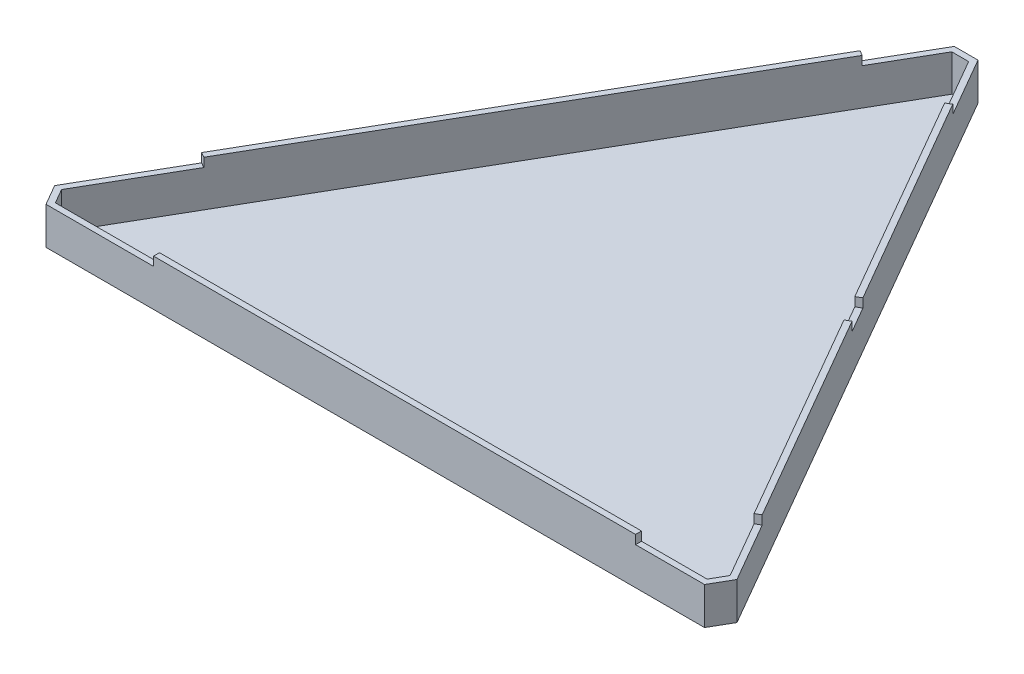
ISO-10303-21;
HEADER;
FILE_DESCRIPTION(('STEP AP214'),'2;1');
FILE_NAME('part.step','',(''),(''),'','','');
FILE_SCHEMA(('AUTOMOTIVE_DESIGN { 1 0 10303 214 1 1 1 1 }'));
ENDSEC;
DATA;
#1=APPLICATION_CONTEXT('core data for automotive mechanical design processes');
#2=APPLICATION_PROTOCOL_DEFINITION('international standard','automotive_design',2000,#1);
#3=PRODUCT_CONTEXT('',#1,'mechanical');
#4=PRODUCT('Part','Part','',(#3));
#5=PRODUCT_RELATED_PRODUCT_CATEGORY('part','',(#4));
#6=PRODUCT_DEFINITION_FORMATION('','',#4);
#7=PRODUCT_DEFINITION_CONTEXT('part definition',#1,'design');
#8=PRODUCT_DEFINITION('design','',#6,#7);
#9=PRODUCT_DEFINITION_SHAPE('','',#8);
#10=(LENGTH_UNIT() NAMED_UNIT(*) SI_UNIT(.MILLI.,.METRE.));
#11=(NAMED_UNIT(*) PLANE_ANGLE_UNIT() SI_UNIT($,.RADIAN.));
#12=(NAMED_UNIT(*) SI_UNIT($,.STERADIAN.) SOLID_ANGLE_UNIT());
#13=UNCERTAINTY_MEASURE_WITH_UNIT(LENGTH_MEASURE(1.E-05),#10,'distance_accuracy_value','');
#14=(GEOMETRIC_REPRESENTATION_CONTEXT(3) GLOBAL_UNCERTAINTY_ASSIGNED_CONTEXT((#13)) GLOBAL_UNIT_ASSIGNED_CONTEXT((#10,
#11,#12)) REPRESENTATION_CONTEXT('',''));
#15=CARTESIAN_POINT('',(0.,0.,0.));
#16=DIRECTION('',(0.,0.,1.));
#17=DIRECTION('',(1.,0.,0.));
#18=AXIS2_PLACEMENT_3D('',#15,#16,#17);
#19=CARTESIAN_POINT('',(0.,0.2,0.));
#20=DIRECTION('',(0.,1.,0.));
#21=DIRECTION('',(0.,0.,1.));
#22=AXIS2_PLACEMENT_3D('',#19,#20,#21);
#23=PLANE('',#22);
#24=DIRECTION('',(0.500000000000268,0.,-0.866025403784284));
#25=VECTOR('',#24,1.);
#26=CARTESIAN_POINT('',(84.5179491924025,0.2,48.7964607176236));
#27=LINE('',#26,#25);
#28=CARTESIAN_POINT('',(109.845299461621,0.2,4.92820323027552));
#29=VERTEX_POINT('',#28);
#30=CARTESIAN_POINT('',(112.690598923244,0.2,0.));
#31=VERTEX_POINT('',#30);
#32=EDGE_CURVE('E420',#29,#31,#27,.T.);
#33=ORIENTED_EDGE('',*,*,#32,.T.);
#34=DIRECTION('',(0.500000000000004,0.,0.866025403784437));
#35=VECTOR('',#34,1.);
#36=CARTESIAN_POINT('',(84.5179491924322,0.2,-48.7964607176063));
#37=LINE('',#36,#35);
#38=CARTESIAN_POINT('',(2.84529946162275,0.2,-190.257639640145));
#39=VERTEX_POINT('',#38);
#40=EDGE_CURVE('E60',#39,#31,#37,.T.);
#41=ORIENTED_EDGE('',*,*,#40,.F.);
#42=DIRECTION('',(1.,0.,-3.02401506656851E-13));
#43=VECTOR('',#42,1.);
#44=CARTESIAN_POINT('',(-5.7534196880156E-11,0.2,-190.257639640144));
#45=LINE('',#44,#43);
#46=CARTESIAN_POINT('',(-2.84529946162175,0.2,-190.257639640144));
#47=VERTEX_POINT('',#46);
#48=EDGE_CURVE('E424',#47,#39,#45,.T.);
#49=ORIENTED_EDGE('',*,*,#48,.F.);
#50=DIRECTION('',(-0.499999999999966,0.,0.866025403784458));
#51=VECTOR('',#50,1.);
#52=CARTESIAN_POINT('',(-84.5179491924274,0.2,-48.7964607175987));
#53=LINE('',#52,#51);
#54=CARTESIAN_POINT('',(-112.690598923241,0.2,0.));
#55=VERTEX_POINT('',#54);
#56=EDGE_CURVE('E52',#47,#55,#53,.T.);
#57=ORIENTED_EDGE('',*,*,#56,.T.);
#58=DIRECTION('',(-0.499999999999998,0.,-0.86602540378444));
#59=VECTOR('',#58,1.);
#60=CARTESIAN_POINT('',(-84.5179491924314,0.2,48.7964607176051));
#61=LINE('',#60,#59);
#62=CARTESIAN_POINT('',(-109.845299461621,0.200000000000001,4.92820323027554));
#63=VERTEX_POINT('',#62);
#64=EDGE_CURVE('E388',#63,#55,#61,.T.);
#65=ORIENTED_EDGE('',*,*,#64,.F.);
#66=DIRECTION('',(1.,0.,0.));
#67=VECTOR('',#66,1.);
#68=CARTESIAN_POINT('',(0.,0.2,4.92820323027603));
#69=LINE('',#68,#67);
#70=EDGE_CURVE('E418',#63,#29,#69,.T.);
#71=ORIENTED_EDGE('',*,*,#70,.T.);
#72=EDGE_LOOP('',(#33,#41,#49,#57,#65,#71));
#73=FACE_BOUND('',#72,.T.);
#74=ADVANCED_FACE('F37',(#73),#23,.T.);
#75=CARTESIAN_POINT('',(86.25,0.2,-49.7964607176053));
#76=DIRECTION('',(-0.866025403784439,0.,0.5));
#77=DIRECTION('',(0.5,0.,0.866025403784439));
#78=AXIS2_PLACEMENT_3D('',#75,#76,#77);
#79=PLANE('',#78);
#80=DIRECTION('',(-0.5,0.,-0.866025403784439));
#81=VECTOR('',#80,1.);
#82=CARTESIAN_POINT('',(86.25,0.,-49.7964607176053));
#83=LINE('',#82,#81);
#84=CARTESIAN_POINT('',(115.,0.,0.));
#85=VERTEX_POINT('',#84);
#86=CARTESIAN_POINT('',(4.,0.,-192.257639640145));
#87=VERTEX_POINT('',#86);
#88=EDGE_CURVE('E422',#85,#87,#83,.T.);
#89=ORIENTED_EDGE('',*,*,#88,.T.);
#90=DIRECTION('',(0.,-1.,0.));
#91=VECTOR('',#90,1.);
#92=CARTESIAN_POINT('',(4.,12.58,-192.257639640145));
#93=LINE('',#92,#91);
#94=CARTESIAN_POINT('',(4.,12.58,-192.257639640145));
#95=VERTEX_POINT('',#94);
#96=EDGE_CURVE('E357',#95,#87,#93,.T.);
#97=ORIENTED_EDGE('',*,*,#96,.F.);
#98=DIRECTION('',(0.500000000000004,0.,0.866025403784436));
#99=VECTOR('',#98,1.);
#100=CARTESIAN_POINT('',(86.2500000000004,12.58,-49.796460717606));
#101=LINE('',#100,#99);
#102=CARTESIAN_POINT('',(15.625000000015,12.58,-172.122549002131));
#103=VERTEX_POINT('',#102);
#104=EDGE_CURVE('E326',#95,#103,#101,.T.);
#105=ORIENTED_EDGE('',*,*,#104,.T.);
#106=DIRECTION('',(0.,-1.,0.));
#107=VECTOR('',#106,1.);
#108=CARTESIAN_POINT('',(15.625000000015,15.58,-172.122549002131));
#109=LINE('',#108,#107);
#110=CARTESIAN_POINT('',(15.625000000015,15.58,-172.122549002131));
#111=VERTEX_POINT('',#110);
#112=EDGE_CURVE('E268',#111,#103,#109,.T.);
#113=ORIENTED_EDGE('',*,*,#112,.F.);
#114=DIRECTION('',(0.500000000000004,0.,0.866025403784437));
#115=VECTOR('',#114,1.);
#116=CARTESIAN_POINT('',(86.2500000000004,15.58,-49.7964607176059));
#117=LINE('',#116,#115);
#118=CARTESIAN_POINT('',(57.0000000000145,15.58,-100.458946838971));
#119=VERTEX_POINT('',#118);
#120=EDGE_CURVE('E250',#111,#119,#117,.T.);
#121=ORIENTED_EDGE('',*,*,#120,.T.);
#122=DIRECTION('',(0.,-1.,0.));
#123=VECTOR('',#122,1.);
#124=CARTESIAN_POINT('',(57.0000000000145,15.58,-100.458946838971));
#125=LINE('',#124,#123);
#126=CARTESIAN_POINT('',(57.0000000000145,12.58,-100.458946838971));
#127=VERTEX_POINT('',#126);
#128=EDGE_CURVE('E270',#119,#127,#125,.T.);
#129=ORIENTED_EDGE('',*,*,#128,.T.);
#130=DIRECTION('',(0.499999999999934,0.,0.866025403784477));
#131=VECTOR('',#130,1.);
#132=CARTESIAN_POINT('',(86.2500000000003,12.58,-49.7964607175967));
#133=LINE('',#132,#131);
#134=CARTESIAN_POINT('',(62.0000000000138,12.58,-91.7986928011259));
#135=VERTEX_POINT('',#134);
#136=EDGE_CURVE('E317',#127,#135,#133,.T.);
#137=ORIENTED_EDGE('',*,*,#136,.T.);
#138=DIRECTION('',(0.,-1.,0.));
#139=VECTOR('',#138,1.);
#140=CARTESIAN_POINT('',(62.0000000000138,15.58,-91.7986928011259));
#141=LINE('',#140,#139);
#142=CARTESIAN_POINT('',(62.0000000000138,15.58,-91.7986928011259));
#143=VERTEX_POINT('',#142);
#144=EDGE_CURVE('E495',#143,#135,#141,.T.);
#145=ORIENTED_EDGE('',*,*,#144,.F.);
#146=DIRECTION('',(0.500000000000004,0.,0.866025403784436));
#147=VECTOR('',#146,1.);
#148=CARTESIAN_POINT('',(86.2499999999997,15.58,-49.7964607176056));
#149=LINE('',#148,#147);
#150=CARTESIAN_POINT('',(103.375000000009,15.58,-20.1350906379728));
#151=VERTEX_POINT('',#150);
#152=EDGE_CURVE('E240',#143,#151,#149,.T.);
#153=ORIENTED_EDGE('',*,*,#152,.T.);
#154=DIRECTION('',(0.,-1.,0.));
#155=VECTOR('',#154,1.);
#156=CARTESIAN_POINT('',(103.375000000009,15.58,-20.1350906379728));
#157=LINE('',#156,#155);
#158=CARTESIAN_POINT('',(103.375000000009,12.58,-20.1350906379728));
#159=VERTEX_POINT('',#158);
#160=EDGE_CURVE('E252',#151,#159,#157,.T.);
#161=ORIENTED_EDGE('',*,*,#160,.T.);
#162=DIRECTION('',(-0.5,0.,-0.866025403784439));
#163=VECTOR('',#162,1.);
#164=CARTESIAN_POINT('',(86.25,12.58,-49.7964607176053));
#165=LINE('',#164,#163);
#166=CARTESIAN_POINT('',(115.,12.58,0.));
#167=VERTEX_POINT('',#166);
#168=EDGE_CURVE('E410',#167,#159,#165,.T.);
#169=ORIENTED_EDGE('',*,*,#168,.F.);
#170=DIRECTION('',(0.,-1.,0.));
#171=VECTOR('',#170,1.);
#172=CARTESIAN_POINT('',(115.,0.2,0.));
#173=LINE('',#172,#171);
#174=EDGE_CURVE('E429',#167,#85,#173,.T.);
#175=ORIENTED_EDGE('',*,*,#174,.T.);
#176=EDGE_LOOP('',(#89,#97,#105,#113,#121,#129,#137,#145,#153,#161,#169,#175));
#177=FACE_BOUND('',#176,.T.);
#178=ADVANCED_FACE('F39',(#177),#79,.F.);
#179=CARTESIAN_POINT('',(-86.2499999999976,0.2,-49.7964607176066));
#180=DIRECTION('',(-0.866025403784427,0.,-0.500000000000021));
#181=DIRECTION('',(-0.500000000000021,0.,0.866025403784427));
#182=AXIS2_PLACEMENT_3D('',#179,#180,#181);
#183=PLANE('',#182);
#184=DIRECTION('',(0.,-1.,0.));
#185=VECTOR('',#184,1.);
#186=CARTESIAN_POINT('',(-4.,12.58,-192.257639640145));
#187=LINE('',#186,#185);
#188=CARTESIAN_POINT('',(-4.,12.58,-192.257639640145));
#189=VERTEX_POINT('',#188);
#190=CARTESIAN_POINT('',(-4.,0.,-192.257639640145));
#191=VERTEX_POINT('',#190);
#192=EDGE_CURVE('E354',#189,#191,#187,.T.);
#193=ORIENTED_EDGE('',*,*,#192,.T.);
#194=DIRECTION('',(0.500000000000021,0.,-0.866025403784427));
#195=VECTOR('',#194,1.);
#196=CARTESIAN_POINT('',(-86.2499999999976,0.,-49.7964607176066));
#197=LINE('',#196,#195);
#198=CARTESIAN_POINT('',(-115.,0.,0.));
#199=VERTEX_POINT('',#198);
#200=EDGE_CURVE('E431',#199,#191,#197,.T.);
#201=ORIENTED_EDGE('',*,*,#200,.F.);
#202=DIRECTION('',(0.,-1.,0.));
#203=VECTOR('',#202,1.);
#204=CARTESIAN_POINT('',(-115.,0.2,0.));
#205=LINE('',#204,#203);
#206=CARTESIAN_POINT('',(-115.,12.58,0.));
#207=VERTEX_POINT('',#206);
#208=EDGE_CURVE('E11',#207,#199,#205,.T.);
#209=ORIENTED_EDGE('',*,*,#208,.F.);
#210=DIRECTION('',(0.500000000000021,0.,-0.866025403784427));
#211=VECTOR('',#210,1.);
#212=CARTESIAN_POINT('',(-86.2499999999976,12.58,-49.7964607176066));
#213=LINE('',#212,#211);
#214=CARTESIAN_POINT('',(-96.8699999999991,12.58,-31.4020811412236));
#215=VERTEX_POINT('',#214);
#216=EDGE_CURVE('E362',#207,#215,#213,.T.);
#217=ORIENTED_EDGE('',*,*,#216,.T.);
#218=DIRECTION('',(0.,-1.,0.));
#219=VECTOR('',#218,1.);
#220=CARTESIAN_POINT('',(-96.8699999999991,15.58,-31.4020811412236));
#221=LINE('',#220,#219);
#222=CARTESIAN_POINT('',(-96.8699999999991,15.58,-31.4020811412236));
#223=VERTEX_POINT('',#222);
#224=EDGE_CURVE('E292',#223,#215,#221,.T.);
#225=ORIENTED_EDGE('',*,*,#224,.F.);
#226=DIRECTION('',(0.499999999999995,0.,-0.866025403784441));
#227=VECTOR('',#226,1.);
#228=CARTESIAN_POINT('',(-86.2499999999996,15.58,-49.7964607176044));
#229=LINE('',#228,#227);
#230=CARTESIAN_POINT('',(-15.6250000000001,15.58,-172.122549002157));
#231=VERTEX_POINT('',#230);
#232=EDGE_CURVE('E273',#223,#231,#229,.T.);
#233=ORIENTED_EDGE('',*,*,#232,.T.);
#234=DIRECTION('',(0.,-1.,0.));
#235=VECTOR('',#234,1.);
#236=CARTESIAN_POINT('',(-15.6250000000001,15.58,-172.122549002157));
#237=LINE('',#236,#235);
#238=CARTESIAN_POINT('',(-15.6250000000001,12.58,-172.122549002157));
#239=VERTEX_POINT('',#238);
#240=EDGE_CURVE('E284',#231,#239,#237,.T.);
#241=ORIENTED_EDGE('',*,*,#240,.T.);
#242=DIRECTION('',(0.500000000000003,0.,-0.866025403784437));
#243=VECTOR('',#242,1.);
#244=CARTESIAN_POINT('',(-86.2500000000003,12.58,-49.7964607176057));
#245=LINE('',#244,#243);
#246=EDGE_CURVE('E331',#239,#189,#245,.T.);
#247=ORIENTED_EDGE('',*,*,#246,.T.);
#248=EDGE_LOOP('',(#193,#201,#209,#217,#225,#233,#241,#247));
#249=FACE_BOUND('',#248,.T.);
#250=ADVANCED_FACE('F482',(#249),#183,.T.);
#251=CARTESIAN_POINT('',(-86.25,0.2,49.7964607176052));
#252=DIRECTION('',(0.866025403784439,0.,-0.5));
#253=DIRECTION('',(-0.5,0.,-0.866025403784439));
#254=AXIS2_PLACEMENT_3D('',#251,#252,#253);
#255=PLANE('',#254);
#256=DIRECTION('',(0.5,0.,0.866025403784439));
#257=VECTOR('',#256,1.);
#258=CARTESIAN_POINT('',(-86.25,0.,49.7964607176052));
#259=LINE('',#258,#257);
#260=CARTESIAN_POINT('',(-111.,0.,6.92820323027554));
#261=VERTEX_POINT('',#260);
#262=EDGE_CURVE('E433',#199,#261,#259,.T.);
#263=ORIENTED_EDGE('',*,*,#262,.T.);
#264=DIRECTION('',(0.,-1.,0.));
#265=VECTOR('',#264,1.);
#266=CARTESIAN_POINT('',(-111.,0.2,6.92820323027554));
#267=LINE('',#266,#265);
#268=CARTESIAN_POINT('',(-111.,12.58,6.92820323027554));
#269=VERTEX_POINT('',#268);
#270=EDGE_CURVE('E45',#269,#261,#267,.T.);
#271=ORIENTED_EDGE('',*,*,#270,.F.);
#272=DIRECTION('',(0.5,0.,0.866025403784439));
#273=VECTOR('',#272,1.);
#274=CARTESIAN_POINT('',(-86.25,12.58,49.7964607176052));
#275=LINE('',#274,#273);
#276=EDGE_CURVE('E365',#207,#269,#275,.T.);
#277=ORIENTED_EDGE('',*,*,#276,.F.);
#278=ORIENTED_EDGE('',*,*,#208,.T.);
#279=EDGE_LOOP('',(#263,#271,#277,#278));
#280=FACE_BOUND('',#279,.T.);
#281=ADVANCED_FACE('F480',(#280),#255,.F.);
#282=CARTESIAN_POINT('',(0.,0.2,6.92820323027546));
#283=DIRECTION('',(0.,0.,-1.));
#284=DIRECTION('',(-1.,0.,0.));
#285=AXIS2_PLACEMENT_3D('',#282,#283,#284);
#286=PLANE('',#285);
#287=DIRECTION('',(1.,0.,0.));
#288=VECTOR('',#287,1.);
#289=CARTESIAN_POINT('',(0.,12.58,6.92820323027546));
#290=LINE('',#289,#288);
#291=CARTESIAN_POINT('',(87.75,12.58,6.92820323027546));
#292=VERTEX_POINT('',#291);
#293=CARTESIAN_POINT('',(111.,12.58,6.92820323027546));
#294=VERTEX_POINT('',#293);
#295=EDGE_CURVE('E404',#292,#294,#290,.T.);
#296=ORIENTED_EDGE('',*,*,#295,.F.);
#297=DIRECTION('',(0.,-1.,0.));
#298=VECTOR('',#297,1.);
#299=CARTESIAN_POINT('',(87.75,15.58,6.92820323027546));
#300=LINE('',#299,#298);
#301=CARTESIAN_POINT('',(87.75,15.58,6.92820323027546));
#302=VERTEX_POINT('',#301);
#303=EDGE_CURVE('E311',#302,#292,#300,.T.);
#304=ORIENTED_EDGE('',*,*,#303,.F.);
#305=DIRECTION('',(-1.,0.,0.));
#306=VECTOR('',#305,1.);
#307=CARTESIAN_POINT('',(0.,15.58,6.92820323027639));
#308=LINE('',#307,#306);
#309=CARTESIAN_POINT('',(-74.739999999997,15.58,6.92820323027718));
#310=VERTEX_POINT('',#309);
#311=EDGE_CURVE('E297',#302,#310,#308,.T.);
#312=ORIENTED_EDGE('',*,*,#311,.T.);
#313=DIRECTION('',(0.,-1.,0.));
#314=VECTOR('',#313,1.);
#315=CARTESIAN_POINT('',(-74.739999999997,15.58,6.92820323027718));
#316=LINE('',#315,#314);
#317=CARTESIAN_POINT('',(-74.739999999997,12.58,6.92820323027718));
#318=VERTEX_POINT('',#317);
#319=EDGE_CURVE('E313',#310,#318,#316,.T.);
#320=ORIENTED_EDGE('',*,*,#319,.T.);
#321=DIRECTION('',(1.,0.,0.));
#322=VECTOR('',#321,1.);
#323=CARTESIAN_POINT('',(-3.1521261630446E-13,12.58,6.92820323028058));
#324=LINE('',#323,#322);
#325=EDGE_CURVE('E368',#269,#318,#324,.T.);
#326=ORIENTED_EDGE('',*,*,#325,.F.);
#327=ORIENTED_EDGE('',*,*,#270,.T.);
#328=DIRECTION('',(1.,0.,0.));
#329=VECTOR('',#328,1.);
#330=CARTESIAN_POINT('',(0.,0.,6.92820323027546));
#331=LINE('',#330,#329);
#332=CARTESIAN_POINT('',(111.,0.,6.92820323027546));
#333=VERTEX_POINT('',#332);
#334=EDGE_CURVE('E435',#261,#333,#331,.T.);
#335=ORIENTED_EDGE('',*,*,#334,.T.);
#336=DIRECTION('',(0.,-1.,0.));
#337=VECTOR('',#336,1.);
#338=CARTESIAN_POINT('',(111.,0.2,6.92820323027546));
#339=LINE('',#338,#337);
#340=EDGE_CURVE('E440',#294,#333,#339,.T.);
#341=ORIENTED_EDGE('',*,*,#340,.F.);
#342=EDGE_LOOP('',(#296,#304,#312,#320,#326,#327,#335,#341));
#343=FACE_BOUND('',#342,.T.);
#344=ADVANCED_FACE('F447',(#343),#286,.F.);
#345=CARTESIAN_POINT('',(86.25,0.2,49.7964607176052));
#346=DIRECTION('',(0.866025403784439,0.,0.5));
#347=DIRECTION('',(0.5,0.,-0.866025403784439));
#348=AXIS2_PLACEMENT_3D('',#345,#346,#347);
#349=PLANE('',#348);
#350=DIRECTION('',(-0.5,0.,0.866025403784439));
#351=VECTOR('',#350,1.);
#352=CARTESIAN_POINT('',(86.25,0.,49.7964607176052));
#353=LINE('',#352,#351);
#354=EDGE_CURVE('E425',#85,#333,#353,.T.);
#355=ORIENTED_EDGE('',*,*,#354,.F.);
#356=ORIENTED_EDGE('',*,*,#174,.F.);
#357=DIRECTION('',(-0.5,0.,0.866025403784439));
#358=VECTOR('',#357,1.);
#359=CARTESIAN_POINT('',(86.25,12.58,49.7964607176052));
#360=LINE('',#359,#358);
#361=EDGE_CURVE('E407',#167,#294,#360,.T.);
#362=ORIENTED_EDGE('',*,*,#361,.T.);
#363=ORIENTED_EDGE('',*,*,#340,.T.);
#364=EDGE_LOOP('',(#355,#356,#362,#363));
#365=FACE_BOUND('',#364,.T.);
#366=ADVANCED_FACE('F458',(#365),#349,.T.);
#367=CARTESIAN_POINT('',(0.,0.,0.));
#368=DIRECTION('',(0.,1.,0.));
#369=DIRECTION('',(0.,0.,1.));
#370=AXIS2_PLACEMENT_3D('',#367,#368,#369);
#371=PLANE('',#370);
#372=DIRECTION('',(-1.,0.,0.));
#373=VECTOR('',#372,1.);
#374=CARTESIAN_POINT('',(0.,0.,-192.257639640145));
#375=LINE('',#374,#373);
#376=EDGE_CURVE('E325',#87,#191,#375,.T.);
#377=ORIENTED_EDGE('',*,*,#376,.F.);
#378=ORIENTED_EDGE('',*,*,#88,.F.);
#379=ORIENTED_EDGE('',*,*,#354,.T.);
#380=ORIENTED_EDGE('',*,*,#334,.F.);
#381=ORIENTED_EDGE('',*,*,#262,.F.);
#382=ORIENTED_EDGE('',*,*,#200,.T.);
#383=EDGE_LOOP('',(#377,#378,#379,#380,#381,#382));
#384=FACE_BOUND('',#383,.T.);
#385=ADVANCED_FACE('F453',(#384),#371,.F.);
#386=CARTESIAN_POINT('',(84.5179491924322,12.58,-48.7964607176064));
#387=DIRECTION('',(0.866025403784436,0.,-0.500000000000004));
#388=DIRECTION('',(-0.500000000000004,0.,-0.866025403784436));
#389=AXIS2_PLACEMENT_3D('',#386,#387,#388);
#390=PLANE('',#389);
#391=ORIENTED_EDGE('',*,*,#40,.T.);
#392=DIRECTION('',(0.,-1.,0.));
#393=VECTOR('',#392,1.);
#394=CARTESIAN_POINT('',(112.690598923244,12.58,0.));
#395=LINE('',#394,#393);
#396=CARTESIAN_POINT('',(112.690598923244,12.58,0.));
#397=VERTEX_POINT('',#396);
#398=EDGE_CURVE('E415',#397,#31,#395,.T.);
#399=ORIENTED_EDGE('',*,*,#398,.F.);
#400=DIRECTION('',(0.500000000000004,0.,0.866025403784436));
#401=VECTOR('',#400,1.);
#402=CARTESIAN_POINT('',(84.5179491924322,12.58,-48.7964607176064));
#403=LINE('',#402,#401);
#404=CARTESIAN_POINT('',(101.642949192441,12.58,-19.1350906379736));
#405=VERTEX_POINT('',#404);
#406=EDGE_CURVE('E394',#405,#397,#403,.T.);
#407=ORIENTED_EDGE('',*,*,#406,.F.);
#408=DIRECTION('',(0.,-1.,0.));
#409=VECTOR('',#408,1.);
#410=CARTESIAN_POINT('',(101.642949192441,15.58,-19.1350906379736));
#411=LINE('',#410,#409);
#412=CARTESIAN_POINT('',(101.642949192441,15.58,-19.1350906379736));
#413=VERTEX_POINT('',#412);
#414=EDGE_CURVE('E229',#413,#405,#411,.T.);
#415=ORIENTED_EDGE('',*,*,#414,.F.);
#416=DIRECTION('',(0.500000000000004,0.,0.866025403784437));
#417=VECTOR('',#416,1.);
#418=CARTESIAN_POINT('',(84.5179491924322,15.58,-48.7964607176063));
#419=LINE('',#418,#417);
#420=CARTESIAN_POINT('',(60.2679491924464,15.58,-90.7986928011267));
#421=VERTEX_POINT('',#420);
#422=EDGE_CURVE('E222',#421,#413,#419,.T.);
#423=ORIENTED_EDGE('',*,*,#422,.F.);
#424=DIRECTION('',(0.,-1.,0.));
#425=VECTOR('',#424,1.);
#426=CARTESIAN_POINT('',(60.2679491924464,15.58,-90.7986928011267));
#427=LINE('',#426,#425);
#428=CARTESIAN_POINT('',(60.2679491924464,12.58,-90.7986928011267));
#429=VERTEX_POINT('',#428);
#430=EDGE_CURVE('E227',#421,#429,#427,.T.);
#431=ORIENTED_EDGE('',*,*,#430,.T.);
#432=DIRECTION('',(0.500000000000004,0.,0.866025403784437));
#433=VECTOR('',#432,1.);
#434=CARTESIAN_POINT('',(84.5179491924323,12.58,-48.7964607176064));
#435=LINE('',#434,#433);
#436=CARTESIAN_POINT('',(55.2679491924463,12.58,-99.4589468389711));
#437=VERTEX_POINT('',#436);
#438=EDGE_CURVE('E323',#437,#429,#435,.T.);
#439=ORIENTED_EDGE('',*,*,#438,.F.);
#440=DIRECTION('',(0.,-1.,0.));
#441=VECTOR('',#440,1.);
#442=CARTESIAN_POINT('',(55.2679491924463,15.58,-99.4589468389711));
#443=LINE('',#442,#441);
#444=CARTESIAN_POINT('',(55.2679491924463,15.58,-99.4589468389711));
#445=VERTEX_POINT('',#444);
#446=EDGE_CURVE('E263',#445,#437,#443,.T.);
#447=ORIENTED_EDGE('',*,*,#446,.F.);
#448=DIRECTION('',(-0.500000000000004,0.,-0.866025403784437));
#449=VECTOR('',#448,1.);
#450=CARTESIAN_POINT('',(84.5179491924322,15.58,-48.7964607176063));
#451=LINE('',#450,#449);
#452=CARTESIAN_POINT('',(13.8929491924469,15.58,-171.122549002132));
#453=VERTEX_POINT('',#452);
#454=EDGE_CURVE('E260',#445,#453,#451,.T.);
#455=ORIENTED_EDGE('',*,*,#454,.T.);
#456=DIRECTION('',(0.,-1.,0.));
#457=VECTOR('',#456,1.);
#458=CARTESIAN_POINT('',(13.8929491924469,15.58,-171.122549002132));
#459=LINE('',#458,#457);
#460=CARTESIAN_POINT('',(13.8929491924469,12.58,-171.122549002132));
#461=VERTEX_POINT('',#460);
#462=EDGE_CURVE('E265',#453,#461,#459,.T.);
#463=ORIENTED_EDGE('',*,*,#462,.T.);
#464=DIRECTION('',(0.49999999999997,0.,0.866025403784456));
#465=VECTOR('',#464,1.);
#466=CARTESIAN_POINT('',(84.5179491924294,12.58,-48.7964607176003));
#467=LINE('',#466,#465);
#468=CARTESIAN_POINT('',(2.84529946162275,12.58,-190.257639640145));
#469=VERTEX_POINT('',#468);
#470=EDGE_CURVE('E342',#469,#461,#467,.T.);
#471=ORIENTED_EDGE('',*,*,#470,.F.);
#472=DIRECTION('',(0.,-1.,0.));
#473=VECTOR('',#472,1.);
#474=CARTESIAN_POINT('',(2.84529946162275,12.58,-190.257639640145));
#475=LINE('',#474,#473);
#476=EDGE_CURVE('E347',#469,#39,#475,.T.);
#477=ORIENTED_EDGE('',*,*,#476,.T.);
#478=EDGE_LOOP('',(#391,#399,#407,#415,#423,#431,#439,#447,#455,#463,#471,#477));
#479=FACE_BOUND('',#478,.T.);
#480=ADVANCED_FACE('F224',(#479),#390,.F.);
#481=CARTESIAN_POINT('',(84.5179491924025,12.58,48.7964607176236));
#482=DIRECTION('',(0.866025403784284,0.,0.500000000000268));
#483=DIRECTION('',(0.500000000000268,0.,-0.866025403784284));
#484=AXIS2_PLACEMENT_3D('',#481,#482,#483);
#485=PLANE('',#484);
#486=ORIENTED_EDGE('',*,*,#32,.F.);
#487=DIRECTION('',(0.,-1.,0.));
#488=VECTOR('',#487,1.);
#489=CARTESIAN_POINT('',(109.845299461621,12.58,4.92820323027552));
#490=LINE('',#489,#488);
#491=CARTESIAN_POINT('',(109.845299461621,12.58,4.92820323027552));
#492=VERTEX_POINT('',#491);
#493=EDGE_CURVE('E412',#492,#29,#490,.T.);
#494=ORIENTED_EDGE('',*,*,#493,.F.);
#495=DIRECTION('',(-0.500000000000268,0.,0.866025403784284));
#496=VECTOR('',#495,1.);
#497=CARTESIAN_POINT('',(84.5179491924025,12.58,48.7964607176236));
#498=LINE('',#497,#496);
#499=EDGE_CURVE('E396',#397,#492,#498,.T.);
#500=ORIENTED_EDGE('',*,*,#499,.F.);
#501=ORIENTED_EDGE('',*,*,#398,.T.);
#502=EDGE_LOOP('',(#486,#494,#500,#501));
#503=FACE_BOUND('',#502,.T.);
#504=ADVANCED_FACE('F529',(#503),#485,.F.);
#505=CARTESIAN_POINT('',(0.,12.58,4.92820323027603));
#506=DIRECTION('',(0.,0.,1.));
#507=DIRECTION('',(1.,0.,0.));
#508=AXIS2_PLACEMENT_3D('',#505,#506,#507);
#509=PLANE('',#508);
#510=ORIENTED_EDGE('',*,*,#70,.F.);
#511=DIRECTION('',(0.,-1.,0.));
#512=VECTOR('',#511,1.);
#513=CARTESIAN_POINT('',(-109.845299461621,12.58,4.92820323027554));
#514=LINE('',#513,#512);
#515=CARTESIAN_POINT('',(-109.845299461621,12.58,4.92820323027554));
#516=VERTEX_POINT('',#515);
#517=EDGE_CURVE('E385',#516,#63,#514,.T.);
#518=ORIENTED_EDGE('',*,*,#517,.F.);
#519=DIRECTION('',(1.,0.,0.));
#520=VECTOR('',#519,1.);
#521=CARTESIAN_POINT('',(-1.24807318528596E-13,12.58,4.92820323027832));
#522=LINE('',#521,#520);
#523=CARTESIAN_POINT('',(-74.739999999997,12.58,4.92820323027643));
#524=VERTEX_POINT('',#523);
#525=EDGE_CURVE('E374',#516,#524,#522,.T.);
#526=ORIENTED_EDGE('',*,*,#525,.T.);
#527=DIRECTION('',(0.,-1.,0.));
#528=VECTOR('',#527,1.);
#529=CARTESIAN_POINT('',(-74.739999999997,15.58,4.92820323027643));
#530=LINE('',#529,#528);
#531=CARTESIAN_POINT('',(-74.739999999997,15.58,4.92820323027643));
#532=VERTEX_POINT('',#531);
#533=EDGE_CURVE('E306',#532,#524,#530,.T.);
#534=ORIENTED_EDGE('',*,*,#533,.F.);
#535=DIRECTION('',(1.,0.,0.));
#536=VECTOR('',#535,1.);
#537=CARTESIAN_POINT('',(0.,15.58,4.92820323027606));
#538=LINE('',#537,#536);
#539=CARTESIAN_POINT('',(87.75,15.58,4.92820323027563));
#540=VERTEX_POINT('',#539);
#541=EDGE_CURVE('E303',#532,#540,#538,.T.);
#542=ORIENTED_EDGE('',*,*,#541,.T.);
#543=DIRECTION('',(0.,-1.,0.));
#544=VECTOR('',#543,1.);
#545=CARTESIAN_POINT('',(87.75,15.58,4.92820323027563));
#546=LINE('',#545,#544);
#547=CARTESIAN_POINT('',(87.75,12.58,4.92820323027563));
#548=VERTEX_POINT('',#547);
#549=EDGE_CURVE('E308',#540,#548,#546,.T.);
#550=ORIENTED_EDGE('',*,*,#549,.T.);
#551=DIRECTION('',(-1.,0.,0.));
#552=VECTOR('',#551,1.);
#553=CARTESIAN_POINT('',(0.,12.58,4.92820323027603));
#554=LINE('',#553,#552);
#555=EDGE_CURVE('E398',#492,#548,#554,.T.);
#556=ORIENTED_EDGE('',*,*,#555,.F.);
#557=ORIENTED_EDGE('',*,*,#493,.T.);
#558=EDGE_LOOP('',(#510,#518,#526,#534,#542,#550,#556,#557));
#559=FACE_BOUND('',#558,.T.);
#560=ADVANCED_FACE('F468',(#559),#509,.F.);
#561=CARTESIAN_POINT('',(0.,12.58,0.));
#562=DIRECTION('',(0.,1.,0.));
#563=DIRECTION('',(0.,0.,1.));
#564=AXIS2_PLACEMENT_3D('',#561,#562,#563);
#565=PLANE('',#564);
#566=DIRECTION('',(-0.866025403784437,0.,0.500000000000003));
#567=VECTOR('',#566,1.);
#568=CARTESIAN_POINT('',(17.1250000000092,12.58,29.6613700796327));
#569=LINE('',#568,#567);
#570=EDGE_CURVE('E391',#159,#405,#569,.T.);
#571=ORIENTED_EDGE('',*,*,#570,.T.);
#572=ORIENTED_EDGE('',*,*,#406,.T.);
#573=ORIENTED_EDGE('',*,*,#499,.T.);
#574=ORIENTED_EDGE('',*,*,#555,.T.);
#575=DIRECTION('',(0.,0.,1.));
#576=VECTOR('',#575,1.);
#577=CARTESIAN_POINT('',(87.75,12.58,0.));
#578=LINE('',#577,#576);
#579=EDGE_CURVE('E401',#548,#292,#578,.T.);
#580=ORIENTED_EDGE('',*,*,#579,.T.);
#581=ORIENTED_EDGE('',*,*,#295,.T.);
#582=ORIENTED_EDGE('',*,*,#361,.F.);
#583=ORIENTED_EDGE('',*,*,#168,.T.);
#584=EDGE_LOOP('',(#571,#572,#573,#574,#580,#581,#582,#583));
#585=FACE_BOUND('',#584,.T.);
#586=ADVANCED_FACE('F462',(#585),#565,.T.);
#587=CARTESIAN_POINT('',(-84.5179491924314,12.58,48.7964607176051));
#588=DIRECTION('',(0.86602540378444,0.,-0.499999999999998));
#589=DIRECTION('',(-0.499999999999998,0.,-0.86602540378444));
#590=AXIS2_PLACEMENT_3D('',#587,#588,#589);
#591=PLANE('',#590);
#592=ORIENTED_EDGE('',*,*,#517,.T.);
#593=ORIENTED_EDGE('',*,*,#64,.T.);
#594=DIRECTION('',(0.,-1.,0.));
#595=VECTOR('',#594,1.);
#596=CARTESIAN_POINT('',(-112.690598923241,12.58,0.));
#597=LINE('',#596,#595);
#598=CARTESIAN_POINT('',(-112.690598923241,12.58,0.));
#599=VERTEX_POINT('',#598);
#600=EDGE_CURVE('E383',#599,#55,#597,.T.);
#601=ORIENTED_EDGE('',*,*,#600,.F.);
#602=DIRECTION('',(0.499999999999998,0.,0.86602540378444));
#603=VECTOR('',#602,1.);
#604=CARTESIAN_POINT('',(-84.5179491924314,12.58,48.7964607176051));
#605=LINE('',#604,#603);
#606=EDGE_CURVE('E377',#599,#516,#605,.T.);
#607=ORIENTED_EDGE('',*,*,#606,.T.);
#608=EDGE_LOOP('',(#592,#593,#601,#607));
#609=FACE_BOUND('',#608,.T.);
#610=ADVANCED_FACE('F525',(#609),#591,.T.);
#611=CARTESIAN_POINT('',(-84.5179491924306,12.58,-48.7964607176055));
#612=DIRECTION('',(-0.866025403784436,0.,-0.500000000000004));
#613=DIRECTION('',(-0.500000000000004,0.,0.866025403784436));
#614=AXIS2_PLACEMENT_3D('',#611,#612,#613);
#615=PLANE('',#614);
#616=ORIENTED_EDGE('',*,*,#600,.T.);
#617=ORIENTED_EDGE('',*,*,#56,.F.);
#618=DIRECTION('',(0.,-1.,0.));
#619=VECTOR('',#618,1.);
#620=CARTESIAN_POINT('',(-2.84529946162175,12.58,-190.257639640144));
#621=LINE('',#620,#619);
#622=CARTESIAN_POINT('',(-2.84529946162175,12.58,-190.257639640144));
#623=VERTEX_POINT('',#622);
#624=EDGE_CURVE('E351',#623,#47,#621,.T.);
#625=ORIENTED_EDGE('',*,*,#624,.F.);
#626=DIRECTION('',(-0.499999999999966,0.,0.866025403784458));
#627=VECTOR('',#626,1.);
#628=CARTESIAN_POINT('',(-84.5179491924274,12.58,-48.7964607175987));
#629=LINE('',#628,#627);
#630=CARTESIAN_POINT('',(-13.8929491924304,12.58,-171.122549002157));
#631=VERTEX_POINT('',#630);
#632=EDGE_CURVE('E337',#623,#631,#629,.T.);
#633=ORIENTED_EDGE('',*,*,#632,.T.);
#634=DIRECTION('',(0.,-1.,0.));
#635=VECTOR('',#634,1.);
#636=CARTESIAN_POINT('',(-13.8929491924304,15.58,-171.122549002157));
#637=LINE('',#636,#635);
#638=CARTESIAN_POINT('',(-13.8929491924304,15.58,-171.122549002157));
#639=VERTEX_POINT('',#638);
#640=EDGE_CURVE('E287',#639,#631,#637,.T.);
#641=ORIENTED_EDGE('',*,*,#640,.F.);
#642=DIRECTION('',(-0.500000000000004,0.,0.866025403784436));
#643=VECTOR('',#642,1.);
#644=CARTESIAN_POINT('',(-84.5179491924307,15.58,-48.7964607176055));
#645=LINE('',#644,#643);
#646=CARTESIAN_POINT('',(-95.1379491924308,15.58,-30.4020811412239));
#647=VERTEX_POINT('',#646);
#648=EDGE_CURVE('E278',#639,#647,#645,.T.);
#649=ORIENTED_EDGE('',*,*,#648,.T.);
#650=DIRECTION('',(0.,-1.,0.));
#651=VECTOR('',#650,1.);
#652=CARTESIAN_POINT('',(-95.1379491924308,15.58,-30.4020811412239));
#653=LINE('',#652,#651);
#654=CARTESIAN_POINT('',(-95.1379491924308,12.58,-30.4020811412239));
#655=VERTEX_POINT('',#654);
#656=EDGE_CURVE('E289',#647,#655,#653,.T.);
#657=ORIENTED_EDGE('',*,*,#656,.T.);
#658=DIRECTION('',(0.500000000000004,0.,-0.866025403784436));
#659=VECTOR('',#658,1.);
#660=CARTESIAN_POINT('',(-84.5179491924306,12.58,-48.7964607176055));
#661=LINE('',#660,#659);
#662=EDGE_CURVE('E380',#599,#655,#661,.T.);
#663=ORIENTED_EDGE('',*,*,#662,.F.);
#664=EDGE_LOOP('',(#616,#617,#625,#633,#641,#649,#657,#663));
#665=FACE_BOUND('',#664,.T.);
#666=ADVANCED_FACE('F521',(#665),#615,.F.);
#667=CARTESIAN_POINT('',(0.,12.58,0.));
#668=DIRECTION('',(0.,1.,0.));
#669=DIRECTION('',(0.,0.,1.));
#670=AXIS2_PLACEMENT_3D('',#667,#668,#669);
#671=PLANE('',#670);
#672=DIRECTION('',(0.866025403784426,0.,0.500000000000022));
#673=VECTOR('',#672,1.);
#674=CARTESIAN_POINT('',(-10.6200000000016,12.58,18.3943795763831));
#675=LINE('',#674,#673);
#676=EDGE_CURVE('E360',#215,#655,#675,.T.);
#677=ORIENTED_EDGE('',*,*,#676,.F.);
#678=ORIENTED_EDGE('',*,*,#216,.F.);
#679=ORIENTED_EDGE('',*,*,#276,.T.);
#680=ORIENTED_EDGE('',*,*,#325,.T.);
#681=DIRECTION('',(0.,0.,-1.));
#682=VECTOR('',#681,1.);
#683=CARTESIAN_POINT('',(-74.739999999997,12.58,0.));
#684=LINE('',#683,#682);
#685=EDGE_CURVE('E371',#318,#524,#684,.T.);
#686=ORIENTED_EDGE('',*,*,#685,.T.);
#687=ORIENTED_EDGE('',*,*,#525,.F.);
#688=ORIENTED_EDGE('',*,*,#606,.F.);
#689=ORIENTED_EDGE('',*,*,#662,.T.);
#690=EDGE_LOOP('',(#677,#678,#679,#680,#686,#687,#688,#689));
#691=FACE_BOUND('',#690,.T.);
#692=ADVANCED_FACE('F477',(#691),#671,.T.);
#693=CARTESIAN_POINT('',(0.,12.58,-192.257639640145));
#694=DIRECTION('',(0.,0.,1.));
#695=DIRECTION('',(1.,0.,0.));
#696=AXIS2_PLACEMENT_3D('',#693,#694,#695);
#697=PLANE('',#696);
#698=ORIENTED_EDGE('',*,*,#376,.T.);
#699=ORIENTED_EDGE('',*,*,#192,.F.);
#700=DIRECTION('',(-1.,0.,0.));
#701=VECTOR('',#700,1.);
#702=CARTESIAN_POINT('',(0.,12.58,-192.257639640145));
#703=LINE('',#702,#701);
#704=EDGE_CURVE('E329',#95,#189,#703,.T.);
#705=ORIENTED_EDGE('',*,*,#704,.F.);
#706=ORIENTED_EDGE('',*,*,#96,.T.);
#707=EDGE_LOOP('',(#698,#699,#705,#706));
#708=FACE_BOUND('',#707,.T.);
#709=ADVANCED_FACE('F485',(#708),#697,.F.);
#710=CARTESIAN_POINT('',(-5.7534196880156E-11,12.58,-190.257639640144));
#711=DIRECTION('',(-3.02401506656851E-13,0.,-1.));
#712=DIRECTION('',(-1.,0.,3.02401506656851E-13));
#713=AXIS2_PLACEMENT_3D('',#710,#711,#712);
#714=PLANE('',#713);
#715=ORIENTED_EDGE('',*,*,#48,.T.);
#716=ORIENTED_EDGE('',*,*,#476,.F.);
#717=DIRECTION('',(1.,0.,-3.02401506656851E-13));
#718=VECTOR('',#717,1.);
#719=CARTESIAN_POINT('',(-5.7534196880156E-11,12.58,-190.257639640144));
#720=LINE('',#719,#718);
#721=EDGE_CURVE('E340',#623,#469,#720,.T.);
#722=ORIENTED_EDGE('',*,*,#721,.F.);
#723=ORIENTED_EDGE('',*,*,#624,.T.);
#724=EDGE_LOOP('',(#715,#716,#722,#723));
#725=FACE_BOUND('',#724,.T.);
#726=ADVANCED_FACE('F519',(#725),#714,.F.);
#727=CARTESIAN_POINT('',(0.,12.58,0.));
#728=DIRECTION('',(0.,1.,0.));
#729=DIRECTION('',(0.,0.,1.));
#730=AXIS2_PLACEMENT_3D('',#727,#728,#729);
#731=PLANE('',#730);
#732=ORIENTED_EDGE('',*,*,#104,.F.);
#733=ORIENTED_EDGE('',*,*,#704,.T.);
#734=ORIENTED_EDGE('',*,*,#246,.F.);
#735=DIRECTION('',(0.866025403784422,0.,0.50000000000003));
#736=VECTOR('',#735,1.);
#737=CARTESIAN_POINT('',(70.6250000000024,12.58,-122.326088284547));
#738=LINE('',#737,#736);
#739=EDGE_CURVE('E334',#239,#631,#738,.T.);
#740=ORIENTED_EDGE('',*,*,#739,.T.);
#741=ORIENTED_EDGE('',*,*,#632,.F.);
#742=ORIENTED_EDGE('',*,*,#721,.T.);
#743=ORIENTED_EDGE('',*,*,#470,.T.);
#744=DIRECTION('',(-0.866025403784434,0.,0.500000000000008));
#745=VECTOR('',#744,1.);
#746=CARTESIAN_POINT('',(-70.6249999999857,12.58,-122.326088284525));
#747=LINE('',#746,#745);
#748=EDGE_CURVE('E345',#103,#461,#747,.T.);
#749=ORIENTED_EDGE('',*,*,#748,.F.);
#750=EDGE_LOOP('',(#732,#733,#734,#740,#741,#742,#743,#749));
#751=FACE_BOUND('',#750,.T.);
#752=ADVANCED_FACE('F514',(#751),#731,.T.);
#753=CARTESIAN_POINT('',(0.,12.58,0.));
#754=DIRECTION('',(0.,1.,0.));
#755=DIRECTION('',(0.,0.,1.));
#756=AXIS2_PLACEMENT_3D('',#753,#754,#755);
#757=PLANE('',#756);
#758=DIRECTION('',(-0.866025403784438,0.,0.500000000000002));
#759=VECTOR('',#758,1.);
#760=CARTESIAN_POINT('',(-24.2499999999859,12.58,-42.0022320835206));
#761=LINE('',#760,#759);
#762=EDGE_CURVE('E246',#135,#429,#761,.T.);
#763=ORIENTED_EDGE('',*,*,#762,.F.);
#764=ORIENTED_EDGE('',*,*,#136,.F.);
#765=DIRECTION('',(-0.866025403784437,0.,0.500000000000002));
#766=VECTOR('',#765,1.);
#767=CARTESIAN_POINT('',(-29.2499999999859,12.58,-50.6624861213649));
#768=LINE('',#767,#766);
#769=EDGE_CURVE('E320',#127,#437,#768,.T.);
#770=ORIENTED_EDGE('',*,*,#769,.T.);
#771=ORIENTED_EDGE('',*,*,#438,.T.);
#772=EDGE_LOOP('',(#763,#764,#770,#771));
#773=FACE_BOUND('',#772,.T.);
#774=ADVANCED_FACE('F500',(#773),#757,.T.);
#775=CARTESIAN_POINT('',(-74.739999999997,15.58,0.));
#776=DIRECTION('',(-1.,0.,0.));
#777=DIRECTION('',(0.,0.,1.));
#778=AXIS2_PLACEMENT_3D('',#775,#776,#777);
#779=PLANE('',#778);
#780=ORIENTED_EDGE('',*,*,#533,.T.);
#781=ORIENTED_EDGE('',*,*,#685,.F.);
#782=ORIENTED_EDGE('',*,*,#319,.F.);
#783=DIRECTION('',(0.,0.,-1.));
#784=VECTOR('',#783,1.);
#785=CARTESIAN_POINT('',(-74.739999999997,15.58,0.));
#786=LINE('',#785,#784);
#787=EDGE_CURVE('E294',#310,#532,#786,.T.);
#788=ORIENTED_EDGE('',*,*,#787,.T.);
#789=EDGE_LOOP('',(#780,#781,#782,#788));
#790=FACE_BOUND('',#789,.T.);
#791=ADVANCED_FACE('F636',(#790),#779,.T.);
#792=CARTESIAN_POINT('',(87.75,15.58,0.));
#793=DIRECTION('',(1.,0.,0.));
#794=DIRECTION('',(0.,0.,-1.));
#795=AXIS2_PLACEMENT_3D('',#792,#793,#794);
#796=PLANE('',#795);
#797=ORIENTED_EDGE('',*,*,#303,.T.);
#798=ORIENTED_EDGE('',*,*,#579,.F.);
#799=ORIENTED_EDGE('',*,*,#549,.F.);
#800=DIRECTION('',(0.,0.,1.));
#801=VECTOR('',#800,1.);
#802=CARTESIAN_POINT('',(87.75,15.58,0.));
#803=LINE('',#802,#801);
#804=EDGE_CURVE('E300',#540,#302,#803,.T.);
#805=ORIENTED_EDGE('',*,*,#804,.T.);
#806=EDGE_LOOP('',(#797,#798,#799,#805));
#807=FACE_BOUND('',#806,.T.);
#808=ADVANCED_FACE('F465',(#807),#796,.T.);
#809=CARTESIAN_POINT('',(0.,15.58,0.));
#810=DIRECTION('',(0.,1.,0.));
#811=DIRECTION('',(0.,0.,1.));
#812=AXIS2_PLACEMENT_3D('',#809,#810,#811);
#813=PLANE('',#812);
#814=ORIENTED_EDGE('',*,*,#787,.F.);
#815=ORIENTED_EDGE('',*,*,#311,.F.);
#816=ORIENTED_EDGE('',*,*,#804,.F.);
#817=ORIENTED_EDGE('',*,*,#541,.F.);
#818=EDGE_LOOP('',(#814,#815,#816,#817));
#819=FACE_BOUND('',#818,.T.);
#820=ADVANCED_FACE('F472',(#819),#813,.T.);
#821=CARTESIAN_POINT('',(-10.6200000000016,15.58,18.3943795763831));
#822=DIRECTION('',(0.500000000000022,0.,-0.866025403784426));
#823=DIRECTION('',(-0.866025403784426,0.,-0.500000000000022));
#824=AXIS2_PLACEMENT_3D('',#821,#822,#823);
#825=PLANE('',#824);
#826=ORIENTED_EDGE('',*,*,#676,.T.);
#827=ORIENTED_EDGE('',*,*,#656,.F.);
#828=DIRECTION('',(0.866025403784426,0.,0.500000000000022));
#829=VECTOR('',#828,1.);
#830=CARTESIAN_POINT('',(-10.6200000000016,15.58,18.3943795763831));
#831=LINE('',#830,#829);
#832=EDGE_CURVE('E276',#223,#647,#831,.T.);
#833=ORIENTED_EDGE('',*,*,#832,.F.);
#834=ORIENTED_EDGE('',*,*,#224,.T.);
#835=EDGE_LOOP('',(#826,#827,#833,#834));
#836=FACE_BOUND('',#835,.T.);
#837=ADVANCED_FACE('F660',(#836),#825,.F.);
#838=CARTESIAN_POINT('',(70.6250000000024,15.58,-122.326088284547));
#839=DIRECTION('',(0.50000000000003,0.,-0.866025403784422));
#840=DIRECTION('',(-0.866025403784422,0.,-0.50000000000003));
#841=AXIS2_PLACEMENT_3D('',#838,#839,#840);
#842=PLANE('',#841);
#843=ORIENTED_EDGE('',*,*,#640,.T.);
#844=ORIENTED_EDGE('',*,*,#739,.F.);
#845=ORIENTED_EDGE('',*,*,#240,.F.);
#846=DIRECTION('',(0.866025403784422,0.,0.50000000000003));
#847=VECTOR('',#846,1.);
#848=CARTESIAN_POINT('',(70.6250000000024,15.58,-122.326088284547));
#849=LINE('',#848,#847);
#850=EDGE_CURVE('E281',#231,#639,#849,.T.);
#851=ORIENTED_EDGE('',*,*,#850,.T.);
#852=EDGE_LOOP('',(#843,#844,#845,#851));
#853=FACE_BOUND('',#852,.T.);
#854=ADVANCED_FACE('F669',(#853),#842,.T.);
#855=CARTESIAN_POINT('',(0.,15.58,0.));
#856=DIRECTION('',(0.,1.,0.));
#857=DIRECTION('',(0.,0.,1.));
#858=AXIS2_PLACEMENT_3D('',#855,#856,#857);
#859=PLANE('',#858);
#860=ORIENTED_EDGE('',*,*,#232,.F.);
#861=ORIENTED_EDGE('',*,*,#832,.T.);
#862=ORIENTED_EDGE('',*,*,#648,.F.);
#863=ORIENTED_EDGE('',*,*,#850,.F.);
#864=EDGE_LOOP('',(#860,#861,#862,#863));
#865=FACE_BOUND('',#864,.T.);
#866=ADVANCED_FACE('F679',(#865),#859,.T.);
#867=CARTESIAN_POINT('',(-29.2499999999859,15.58,-50.6624861213649));
#868=DIRECTION('',(0.500000000000002,0.,0.866025403784437));
#869=DIRECTION('',(0.866025403784437,0.,-0.500000000000002));
#870=AXIS2_PLACEMENT_3D('',#867,#868,#869);
#871=PLANE('',#870);
#872=ORIENTED_EDGE('',*,*,#446,.T.);
#873=ORIENTED_EDGE('',*,*,#769,.F.);
#874=ORIENTED_EDGE('',*,*,#128,.F.);
#875=DIRECTION('',(-0.866025403784437,0.,0.500000000000002));
#876=VECTOR('',#875,1.);
#877=CARTESIAN_POINT('',(-29.2499999999859,15.58,-50.6624861213649));
#878=LINE('',#877,#876);
#879=EDGE_CURVE('E247',#119,#445,#878,.T.);
#880=ORIENTED_EDGE('',*,*,#879,.T.);
#881=EDGE_LOOP('',(#872,#873,#874,#880));
#882=FACE_BOUND('',#881,.T.);
#883=ADVANCED_FACE('F504',(#882),#871,.T.);
#884=CARTESIAN_POINT('',(-70.6249999999857,15.58,-122.326088284525));
#885=DIRECTION('',(0.500000000000008,0.,0.866025403784434));
#886=DIRECTION('',(0.866025403784434,0.,-0.500000000000008));
#887=AXIS2_PLACEMENT_3D('',#884,#885,#886);
#888=PLANE('',#887);
#889=ORIENTED_EDGE('',*,*,#748,.T.);
#890=ORIENTED_EDGE('',*,*,#462,.F.);
#891=DIRECTION('',(-0.866025403784434,0.,0.500000000000008));
#892=VECTOR('',#891,1.);
#893=CARTESIAN_POINT('',(-70.6249999999857,15.58,-122.326088284525));
#894=LINE('',#893,#892);
#895=EDGE_CURVE('E258',#111,#453,#894,.T.);
#896=ORIENTED_EDGE('',*,*,#895,.F.);
#897=ORIENTED_EDGE('',*,*,#112,.T.);
#898=EDGE_LOOP('',(#889,#890,#896,#897));
#899=FACE_BOUND('',#898,.T.);
#900=ADVANCED_FACE('F511',(#899),#888,.F.);
#901=CARTESIAN_POINT('',(0.,15.58,0.));
#902=DIRECTION('',(0.,1.,0.));
#903=DIRECTION('',(0.,0.,1.));
#904=AXIS2_PLACEMENT_3D('',#901,#902,#903);
#905=PLANE('',#904);
#906=ORIENTED_EDGE('',*,*,#879,.F.);
#907=ORIENTED_EDGE('',*,*,#120,.F.);
#908=ORIENTED_EDGE('',*,*,#895,.T.);
#909=ORIENTED_EDGE('',*,*,#454,.F.);
#910=EDGE_LOOP('',(#906,#907,#908,#909));
#911=FACE_BOUND('',#910,.T.);
#912=ADVANCED_FACE('F507',(#911),#905,.T.);
#913=CARTESIAN_POINT('',(-24.2499999999859,15.58,-42.0022320835206));
#914=DIRECTION('',(0.500000000000002,0.,0.866025403784438));
#915=DIRECTION('',(0.866025403784438,0.,-0.500000000000002));
#916=AXIS2_PLACEMENT_3D('',#913,#914,#915);
#917=PLANE('',#916);
#918=ORIENTED_EDGE('',*,*,#762,.T.);
#919=ORIENTED_EDGE('',*,*,#430,.F.);
#920=DIRECTION('',(-0.866025403784438,0.,0.500000000000002));
#921=VECTOR('',#920,1.);
#922=CARTESIAN_POINT('',(-24.2499999999859,15.58,-42.0022320835206));
#923=LINE('',#922,#921);
#924=EDGE_CURVE('E234',#143,#421,#923,.T.);
#925=ORIENTED_EDGE('',*,*,#924,.F.);
#926=ORIENTED_EDGE('',*,*,#144,.T.);
#927=EDGE_LOOP('',(#918,#919,#925,#926));
#928=FACE_BOUND('',#927,.T.);
#929=ADVANCED_FACE('F245',(#928),#917,.F.);
#930=CARTESIAN_POINT('',(17.1250000000092,15.58,29.6613700796327));
#931=DIRECTION('',(0.500000000000003,0.,0.866025403784437));
#932=DIRECTION('',(0.866025403784437,0.,-0.500000000000003));
#933=AXIS2_PLACEMENT_3D('',#930,#931,#932);
#934=PLANE('',#933);
#935=ORIENTED_EDGE('',*,*,#414,.T.);
#936=ORIENTED_EDGE('',*,*,#570,.F.);
#937=ORIENTED_EDGE('',*,*,#160,.F.);
#938=DIRECTION('',(-0.866025403784437,0.,0.500000000000003));
#939=VECTOR('',#938,1.);
#940=CARTESIAN_POINT('',(17.1250000000092,15.58,29.6613700796327));
#941=LINE('',#940,#939);
#942=EDGE_CURVE('E233',#151,#413,#941,.T.);
#943=ORIENTED_EDGE('',*,*,#942,.T.);
#944=EDGE_LOOP('',(#935,#936,#937,#943));
#945=FACE_BOUND('',#944,.T.);
#946=ADVANCED_FACE('F493',(#945),#934,.T.);
#947=CARTESIAN_POINT('',(0.,15.58,0.));
#948=DIRECTION('',(0.,1.,0.));
#949=DIRECTION('',(0.,0.,1.));
#950=AXIS2_PLACEMENT_3D('',#947,#948,#949);
#951=PLANE('',#950);
#952=ORIENTED_EDGE('',*,*,#924,.T.);
#953=ORIENTED_EDGE('',*,*,#422,.T.);
#954=ORIENTED_EDGE('',*,*,#942,.F.);
#955=ORIENTED_EDGE('',*,*,#152,.F.);
#956=EDGE_LOOP('',(#952,#953,#954,#955));
#957=FACE_BOUND('',#956,.T.);
#958=ADVANCED_FACE('F238',(#957),#951,.T.);
#959=CLOSED_SHELL('',(#74,#178,#250,#281,#344,#366,#385,#480,#504,#560,#586,#610,#666,#692,#709,
#726,#752,#774,#791,#808,#820,#837,#854,#866,#883,#900,#912,#929,#946,#958));
#960=MANIFOLD_SOLID_BREP('B2',#959);
#961=ADVANCED_BREP_SHAPE_REPRESENTATION('',(#18,#960),#14);
#962=SHAPE_DEFINITION_REPRESENTATION(#9,#961);
ENDSEC;
END-ISO-10303-21;
